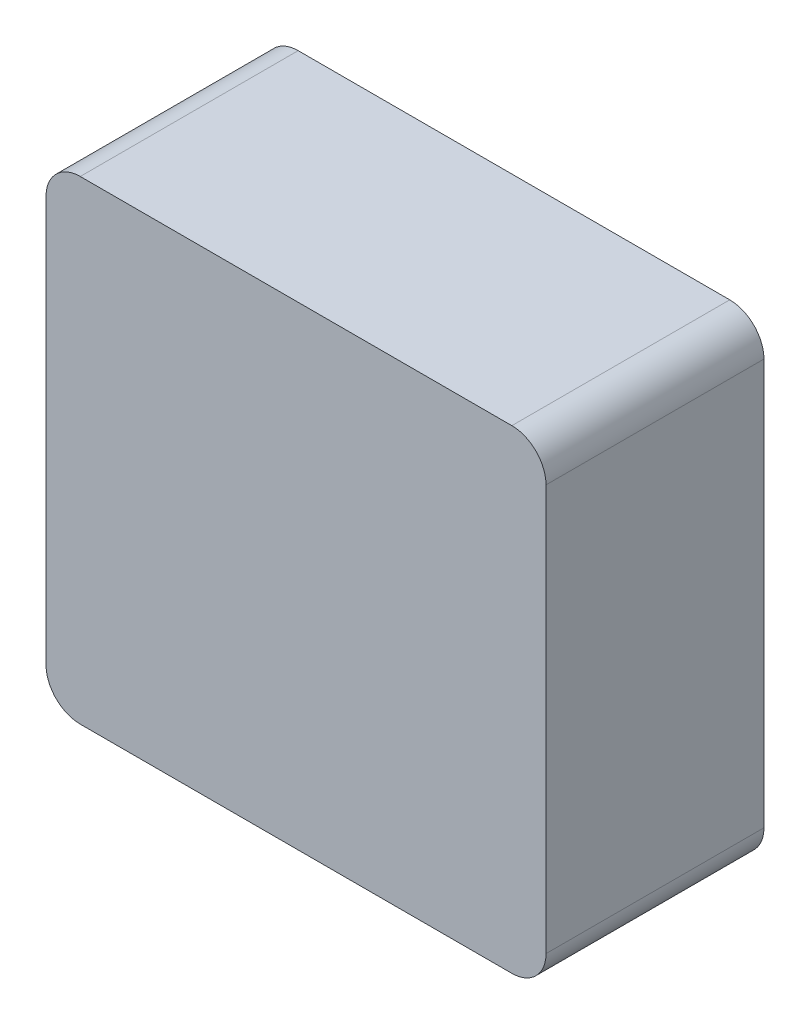
ISO-10303-21;
HEADER;
FILE_DESCRIPTION(('STEP AP214'),'2;1');
FILE_NAME('part.step','',(''),(''),'','','');
FILE_SCHEMA(('AUTOMOTIVE_DESIGN { 1 0 10303 214 1 1 1 1 }'));
ENDSEC;
DATA;
#1=APPLICATION_CONTEXT('core data for automotive mechanical design processes');
#2=APPLICATION_PROTOCOL_DEFINITION('international standard','automotive_design',2000,#1);
#3=PRODUCT_CONTEXT('',#1,'mechanical');
#4=PRODUCT('Part','Part','',(#3));
#5=PRODUCT_RELATED_PRODUCT_CATEGORY('part','',(#4));
#6=PRODUCT_DEFINITION_FORMATION('','',#4);
#7=PRODUCT_DEFINITION_CONTEXT('part definition',#1,'design');
#8=PRODUCT_DEFINITION('design','',#6,#7);
#9=PRODUCT_DEFINITION_SHAPE('','',#8);
#10=(LENGTH_UNIT() NAMED_UNIT(*) SI_UNIT(.MILLI.,.METRE.));
#11=(NAMED_UNIT(*) PLANE_ANGLE_UNIT() SI_UNIT($,.RADIAN.));
#12=(NAMED_UNIT(*) SI_UNIT($,.STERADIAN.) SOLID_ANGLE_UNIT());
#13=UNCERTAINTY_MEASURE_WITH_UNIT(LENGTH_MEASURE(1.E-05),#10,'distance_accuracy_value','');
#14=(GEOMETRIC_REPRESENTATION_CONTEXT(3) GLOBAL_UNCERTAINTY_ASSIGNED_CONTEXT((#13)) GLOBAL_UNIT_ASSIGNED_CONTEXT((#10,
#11,#12)) REPRESENTATION_CONTEXT('',''));
#15=CARTESIAN_POINT('',(0.,0.,0.));
#16=DIRECTION('',(0.,0.,1.));
#17=DIRECTION('',(1.,0.,0.));
#18=AXIS2_PLACEMENT_3D('',#15,#16,#17);
#19=CARTESIAN_POINT('',(11.25,100.5,-4.));
#20=DIRECTION('',(0.,0.,1.));
#21=DIRECTION('',(1.,0.,0.));
#22=AXIS2_PLACEMENT_3D('',#19,#20,#21);
#23=CYLINDRICAL_SURFACE('',#22,5.);
#24=CARTESIAN_POINT('',(11.25,100.5,-4.));
#25=DIRECTION('',(0.,0.,-1.));
#26=DIRECTION('',(-1.,0.,0.));
#27=AXIS2_PLACEMENT_3D('',#24,#25,#26);
#28=CIRCLE('',#27,5.);
#29=CARTESIAN_POINT('',(6.25000000000001,100.5,-4.));
#30=VERTEX_POINT('',#29);
#31=EDGE_CURVE('E51',#30,#30,#28,.T.);
#32=ORIENTED_EDGE('',*,*,#31,.F.);
#33=EDGE_LOOP('',(#32));
#34=FACE_BOUND('',#33,.T.);
#35=CARTESIAN_POINT('',(11.25,100.5,0.));
#36=DIRECTION('',(0.,0.,-1.));
#37=DIRECTION('',(-1.,0.,0.));
#38=AXIS2_PLACEMENT_3D('',#35,#36,#37);
#39=CIRCLE('',#38,5.);
#40=CARTESIAN_POINT('',(6.25000000000001,100.5,0.));
#41=VERTEX_POINT('',#40);
#42=EDGE_CURVE('E11',#41,#41,#39,.T.);
#43=ORIENTED_EDGE('',*,*,#42,.T.);
#44=EDGE_LOOP('',(#43));
#45=FACE_BOUND('',#44,.T.);
#46=ADVANCED_FACE('F47',(#34,#45),#23,.T.);
#47=CARTESIAN_POINT('',(11.25,100.5,-4.));
#48=DIRECTION('',(0.,0.,-1.));
#49=DIRECTION('',(-1.,0.,0.));
#50=AXIS2_PLACEMENT_3D('',#47,#48,#49);
#51=PLANE('',#50);
#52=CARTESIAN_POINT('',(11.25,100.5,-4.));
#53=DIRECTION('',(0.,0.,-1.));
#54=DIRECTION('',(-1.,0.,0.));
#55=AXIS2_PLACEMENT_3D('',#52,#53,#54);
#56=CIRCLE('',#55,3.5);
#57=CARTESIAN_POINT('',(7.75000000000001,100.5,-4.));
#58=VERTEX_POINT('',#57);
#59=EDGE_CURVE('E58',#58,#58,#56,.T.);
#60=ORIENTED_EDGE('',*,*,#59,.F.);
#61=EDGE_LOOP('',(#60));
#62=FACE_BOUND('',#61,.T.);
#63=ORIENTED_EDGE('',*,*,#31,.T.);
#64=EDGE_LOOP('',(#63));
#65=FACE_BOUND('',#64,.T.);
#66=ADVANCED_FACE('F49',(#62,#65),#51,.T.);
#67=CARTESIAN_POINT('',(11.25,100.5,0.));
#68=DIRECTION('',(0.,0.,-1.));
#69=DIRECTION('',(-1.,0.,0.));
#70=AXIS2_PLACEMENT_3D('',#67,#68,#69);
#71=PLANE('',#70);
#72=ORIENTED_EDGE('',*,*,#42,.F.);
#73=EDGE_LOOP('',(#72));
#74=FACE_BOUND('',#73,.T.);
#75=ADVANCED_FACE('F70',(#74),#71,.F.);
#76=CARTESIAN_POINT('',(11.25,100.5,-2.));
#77=DIRECTION('',(0.,0.,-1.));
#78=DIRECTION('',(-1.,0.,0.));
#79=AXIS2_PLACEMENT_3D('',#76,#77,#78);
#80=CYLINDRICAL_SURFACE('',#79,3.5);
#81=CARTESIAN_POINT('',(11.25,100.5,-2.));
#82=DIRECTION('',(0.,0.,-1.));
#83=DIRECTION('',(-1.,0.,0.));
#84=AXIS2_PLACEMENT_3D('',#81,#82,#83);
#85=CIRCLE('',#84,3.5);
#86=CARTESIAN_POINT('',(7.75000000000001,100.5,-2.));
#87=VERTEX_POINT('',#86);
#88=EDGE_CURVE('E60',#87,#87,#85,.T.);
#89=ORIENTED_EDGE('',*,*,#88,.F.);
#90=EDGE_LOOP('',(#89));
#91=FACE_BOUND('',#90,.T.);
#92=ORIENTED_EDGE('',*,*,#59,.T.);
#93=EDGE_LOOP('',(#92));
#94=FACE_BOUND('',#93,.T.);
#95=ADVANCED_FACE('F66',(#91,#94),#80,.F.);
#96=CARTESIAN_POINT('',(11.25,100.5,-2.));
#97=DIRECTION('',(0.,0.,-1.));
#98=DIRECTION('',(-1.,0.,0.));
#99=AXIS2_PLACEMENT_3D('',#96,#97,#98);
#100=PLANE('',#99);
#101=ORIENTED_EDGE('',*,*,#88,.T.);
#102=EDGE_LOOP('',(#101));
#103=FACE_BOUND('',#102,.T.);
#104=ADVANCED_FACE('F78',(#103),#100,.T.);
#105=CLOSED_SHELL('',(#46,#66,#75,#95,#104));
#106=MANIFOLD_SOLID_BREP('B2',#105);
#107=CARTESIAN_POINT('',(11.25,10.5,-4.));
#108=DIRECTION('',(0.,0.,1.));
#109=DIRECTION('',(1.,0.,0.));
#110=AXIS2_PLACEMENT_3D('',#107,#108,#109);
#111=CYLINDRICAL_SURFACE('',#110,5.);
#112=CARTESIAN_POINT('',(11.25,10.5,-4.));
#113=DIRECTION('',(0.,0.,-1.));
#114=DIRECTION('',(-1.,0.,0.));
#115=AXIS2_PLACEMENT_3D('',#112,#113,#114);
#116=CIRCLE('',#115,5.);
#117=CARTESIAN_POINT('',(6.25000000000001,10.5,-4.));
#118=VERTEX_POINT('',#117);
#119=EDGE_CURVE('E139',#118,#118,#116,.T.);
#120=ORIENTED_EDGE('',*,*,#119,.F.);
#121=EDGE_LOOP('',(#120));
#122=FACE_BOUND('',#121,.T.);
#123=CARTESIAN_POINT('',(11.25,10.5,0.));
#124=DIRECTION('',(0.,0.,-1.));
#125=DIRECTION('',(-1.,0.,0.));
#126=AXIS2_PLACEMENT_3D('',#123,#124,#125);
#127=CIRCLE('',#126,5.);
#128=CARTESIAN_POINT('',(6.25000000000001,10.5,0.));
#129=VERTEX_POINT('',#128);
#130=EDGE_CURVE('E46',#129,#129,#127,.T.);
#131=ORIENTED_EDGE('',*,*,#130,.T.);
#132=EDGE_LOOP('',(#131));
#133=FACE_BOUND('',#132,.T.);
#134=ADVANCED_FACE('F135',(#122,#133),#111,.T.);
#135=CARTESIAN_POINT('',(11.25,10.5,-4.));
#136=DIRECTION('',(0.,0.,-1.));
#137=DIRECTION('',(-1.,0.,0.));
#138=AXIS2_PLACEMENT_3D('',#135,#136,#137);
#139=PLANE('',#138);
#140=CARTESIAN_POINT('',(11.25,10.5,-4.));
#141=DIRECTION('',(0.,0.,-1.));
#142=DIRECTION('',(-1.,0.,0.));
#143=AXIS2_PLACEMENT_3D('',#140,#141,#142);
#144=CIRCLE('',#143,3.5);
#145=CARTESIAN_POINT('',(7.75000000000001,10.5,-4.));
#146=VERTEX_POINT('',#145);
#147=EDGE_CURVE('E146',#146,#146,#144,.T.);
#148=ORIENTED_EDGE('',*,*,#147,.F.);
#149=EDGE_LOOP('',(#148));
#150=FACE_BOUND('',#149,.T.);
#151=ORIENTED_EDGE('',*,*,#119,.T.);
#152=EDGE_LOOP('',(#151));
#153=FACE_BOUND('',#152,.T.);
#154=ADVANCED_FACE('F137',(#150,#153),#139,.T.);
#155=CARTESIAN_POINT('',(11.25,10.5,0.));
#156=DIRECTION('',(0.,0.,-1.));
#157=DIRECTION('',(-1.,0.,0.));
#158=AXIS2_PLACEMENT_3D('',#155,#156,#157);
#159=PLANE('',#158);
#160=ORIENTED_EDGE('',*,*,#130,.F.);
#161=EDGE_LOOP('',(#160));
#162=FACE_BOUND('',#161,.T.);
#163=ADVANCED_FACE('F158',(#162),#159,.F.);
#164=CARTESIAN_POINT('',(11.25,10.5,-2.));
#165=DIRECTION('',(0.,0.,-1.));
#166=DIRECTION('',(-1.,0.,0.));
#167=AXIS2_PLACEMENT_3D('',#164,#165,#166);
#168=CYLINDRICAL_SURFACE('',#167,3.5);
#169=CARTESIAN_POINT('',(11.25,10.5,-2.));
#170=DIRECTION('',(0.,0.,-1.));
#171=DIRECTION('',(-1.,0.,0.));
#172=AXIS2_PLACEMENT_3D('',#169,#170,#171);
#173=CIRCLE('',#172,3.5);
#174=CARTESIAN_POINT('',(7.75000000000001,10.5,-2.));
#175=VERTEX_POINT('',#174);
#176=EDGE_CURVE('E148',#175,#175,#173,.T.);
#177=ORIENTED_EDGE('',*,*,#176,.F.);
#178=EDGE_LOOP('',(#177));
#179=FACE_BOUND('',#178,.T.);
#180=ORIENTED_EDGE('',*,*,#147,.T.);
#181=EDGE_LOOP('',(#180));
#182=FACE_BOUND('',#181,.T.);
#183=ADVANCED_FACE('F154',(#179,#182),#168,.F.);
#184=CARTESIAN_POINT('',(11.25,10.5,-2.));
#185=DIRECTION('',(0.,0.,-1.));
#186=DIRECTION('',(-1.,0.,0.));
#187=AXIS2_PLACEMENT_3D('',#184,#185,#186);
#188=PLANE('',#187);
#189=ORIENTED_EDGE('',*,*,#176,.T.);
#190=EDGE_LOOP('',(#189));
#191=FACE_BOUND('',#190,.T.);
#192=ADVANCED_FACE('F166',(#191),#188,.T.);
#193=CLOSED_SHELL('',(#134,#154,#163,#183,#192));
#194=MANIFOLD_SOLID_BREP('B6',#193);
#195=CARTESIAN_POINT('',(105.75,10.5,-4.));
#196=DIRECTION('',(0.,0.,1.));
#197=DIRECTION('',(1.,0.,0.));
#198=AXIS2_PLACEMENT_3D('',#195,#196,#197);
#199=CYLINDRICAL_SURFACE('',#198,5.);
#200=CARTESIAN_POINT('',(105.75,10.5,-4.));
#201=DIRECTION('',(0.,0.,-1.));
#202=DIRECTION('',(-1.,0.,0.));
#203=AXIS2_PLACEMENT_3D('',#200,#201,#202);
#204=CIRCLE('',#203,5.);
#205=CARTESIAN_POINT('',(100.75,10.5,-4.));
#206=VERTEX_POINT('',#205);
#207=EDGE_CURVE('E227',#206,#206,#204,.T.);
#208=ORIENTED_EDGE('',*,*,#207,.F.);
#209=EDGE_LOOP('',(#208));
#210=FACE_BOUND('',#209,.T.);
#211=CARTESIAN_POINT('',(105.75,10.5,0.));
#212=DIRECTION('',(0.,0.,-1.));
#213=DIRECTION('',(-1.,0.,0.));
#214=AXIS2_PLACEMENT_3D('',#211,#212,#213);
#215=CIRCLE('',#214,5.);
#216=CARTESIAN_POINT('',(100.75,10.5,0.));
#217=VERTEX_POINT('',#216);
#218=EDGE_CURVE('E134',#217,#217,#215,.T.);
#219=ORIENTED_EDGE('',*,*,#218,.T.);
#220=EDGE_LOOP('',(#219));
#221=FACE_BOUND('',#220,.T.);
#222=ADVANCED_FACE('F223',(#210,#221),#199,.T.);
#223=CARTESIAN_POINT('',(105.75,10.5,-4.));
#224=DIRECTION('',(0.,0.,-1.));
#225=DIRECTION('',(-1.,0.,0.));
#226=AXIS2_PLACEMENT_3D('',#223,#224,#225);
#227=PLANE('',#226);
#228=CARTESIAN_POINT('',(105.75,10.5,-4.));
#229=DIRECTION('',(0.,0.,-1.));
#230=DIRECTION('',(-1.,0.,0.));
#231=AXIS2_PLACEMENT_3D('',#228,#229,#230);
#232=CIRCLE('',#231,3.50000000000001);
#233=CARTESIAN_POINT('',(102.25,10.5,-4.));
#234=VERTEX_POINT('',#233);
#235=EDGE_CURVE('E234',#234,#234,#232,.T.);
#236=ORIENTED_EDGE('',*,*,#235,.F.);
#237=EDGE_LOOP('',(#236));
#238=FACE_BOUND('',#237,.T.);
#239=ORIENTED_EDGE('',*,*,#207,.T.);
#240=EDGE_LOOP('',(#239));
#241=FACE_BOUND('',#240,.T.);
#242=ADVANCED_FACE('F225',(#238,#241),#227,.T.);
#243=CARTESIAN_POINT('',(105.75,10.5,0.));
#244=DIRECTION('',(0.,0.,-1.));
#245=DIRECTION('',(-1.,0.,0.));
#246=AXIS2_PLACEMENT_3D('',#243,#244,#245);
#247=PLANE('',#246);
#248=ORIENTED_EDGE('',*,*,#218,.F.);
#249=EDGE_LOOP('',(#248));
#250=FACE_BOUND('',#249,.T.);
#251=ADVANCED_FACE('F246',(#250),#247,.F.);
#252=CARTESIAN_POINT('',(105.75,10.5,-2.));
#253=DIRECTION('',(0.,0.,-1.));
#254=DIRECTION('',(-1.,0.,0.));
#255=AXIS2_PLACEMENT_3D('',#252,#253,#254);
#256=CYLINDRICAL_SURFACE('',#255,3.50000000000001);
#257=CARTESIAN_POINT('',(105.75,10.5,-2.));
#258=DIRECTION('',(0.,0.,-1.));
#259=DIRECTION('',(-1.,0.,0.));
#260=AXIS2_PLACEMENT_3D('',#257,#258,#259);
#261=CIRCLE('',#260,3.50000000000001);
#262=CARTESIAN_POINT('',(102.25,10.5,-2.));
#263=VERTEX_POINT('',#262);
#264=EDGE_CURVE('E236',#263,#263,#261,.T.);
#265=ORIENTED_EDGE('',*,*,#264,.F.);
#266=EDGE_LOOP('',(#265));
#267=FACE_BOUND('',#266,.T.);
#268=ORIENTED_EDGE('',*,*,#235,.T.);
#269=EDGE_LOOP('',(#268));
#270=FACE_BOUND('',#269,.T.);
#271=ADVANCED_FACE('F242',(#267,#270),#256,.F.);
#272=CARTESIAN_POINT('',(105.75,10.5,-2.));
#273=DIRECTION('',(0.,0.,-1.));
#274=DIRECTION('',(-1.,0.,0.));
#275=AXIS2_PLACEMENT_3D('',#272,#273,#274);
#276=PLANE('',#275);
#277=ORIENTED_EDGE('',*,*,#264,.T.);
#278=EDGE_LOOP('',(#277));
#279=FACE_BOUND('',#278,.T.);
#280=ADVANCED_FACE('F254',(#279),#276,.T.);
#281=CLOSED_SHELL('',(#222,#242,#251,#271,#280));
#282=MANIFOLD_SOLID_BREP('B41',#281);
#283=CARTESIAN_POINT('',(105.75,100.5,-4.));
#284=DIRECTION('',(0.,0.,1.));
#285=DIRECTION('',(1.,0.,0.));
#286=AXIS2_PLACEMENT_3D('',#283,#284,#285);
#287=CYLINDRICAL_SURFACE('',#286,5.00000000000001);
#288=CARTESIAN_POINT('',(105.75,100.5,-4.));
#289=DIRECTION('',(0.,0.,-1.));
#290=DIRECTION('',(-1.,0.,0.));
#291=AXIS2_PLACEMENT_3D('',#288,#289,#290);
#292=CIRCLE('',#291,5.00000000000001);
#293=CARTESIAN_POINT('',(100.75,100.5,-4.));
#294=VERTEX_POINT('',#293);
#295=EDGE_CURVE('E222',#294,#294,#292,.T.);
#296=ORIENTED_EDGE('',*,*,#295,.F.);
#297=EDGE_LOOP('',(#296));
#298=FACE_BOUND('',#297,.T.);
#299=CARTESIAN_POINT('',(105.75,100.5,0.));
#300=DIRECTION('',(0.,0.,-1.));
#301=DIRECTION('',(-1.,0.,0.));
#302=AXIS2_PLACEMENT_3D('',#299,#300,#301);
#303=CIRCLE('',#302,5.00000000000001);
#304=CARTESIAN_POINT('',(100.75,100.5,0.));
#305=VERTEX_POINT('',#304);
#306=EDGE_CURVE('E315',#305,#305,#303,.T.);
#307=ORIENTED_EDGE('',*,*,#306,.T.);
#308=EDGE_LOOP('',(#307));
#309=FACE_BOUND('',#308,.T.);
#310=ADVANCED_FACE('F312',(#298,#309),#287,.T.);
#311=CARTESIAN_POINT('',(105.75,100.5,-4.));
#312=DIRECTION('',(0.,0.,-1.));
#313=DIRECTION('',(-1.,0.,0.));
#314=AXIS2_PLACEMENT_3D('',#311,#312,#313);
#315=PLANE('',#314);
#316=CARTESIAN_POINT('',(105.75,100.5,-4.));
#317=DIRECTION('',(0.,0.,-1.));
#318=DIRECTION('',(-1.,0.,0.));
#319=AXIS2_PLACEMENT_3D('',#316,#317,#318);
#320=CIRCLE('',#319,3.50000000000001);
#321=CARTESIAN_POINT('',(102.25,100.5,-4.));
#322=VERTEX_POINT('',#321);
#323=EDGE_CURVE('E324',#322,#322,#320,.T.);
#324=ORIENTED_EDGE('',*,*,#323,.F.);
#325=EDGE_LOOP('',(#324));
#326=FACE_BOUND('',#325,.T.);
#327=ORIENTED_EDGE('',*,*,#295,.T.);
#328=EDGE_LOOP('',(#327));
#329=FACE_BOUND('',#328,.T.);
#330=ADVANCED_FACE('F339',(#326,#329),#315,.T.);
#331=CARTESIAN_POINT('',(105.75,100.5,0.));
#332=DIRECTION('',(0.,0.,-1.));
#333=DIRECTION('',(-1.,0.,0.));
#334=AXIS2_PLACEMENT_3D('',#331,#332,#333);
#335=PLANE('',#334);
#336=ORIENTED_EDGE('',*,*,#306,.F.);
#337=EDGE_LOOP('',(#336));
#338=FACE_BOUND('',#337,.T.);
#339=ADVANCED_FACE('F335',(#338),#335,.F.);
#340=CARTESIAN_POINT('',(105.75,100.5,-2.));
#341=DIRECTION('',(0.,0.,-1.));
#342=DIRECTION('',(-1.,0.,0.));
#343=AXIS2_PLACEMENT_3D('',#340,#341,#342);
#344=CYLINDRICAL_SURFACE('',#343,3.50000000000001);
#345=CARTESIAN_POINT('',(105.75,100.5,-2.));
#346=DIRECTION('',(0.,0.,-1.));
#347=DIRECTION('',(-1.,0.,0.));
#348=AXIS2_PLACEMENT_3D('',#345,#346,#347);
#349=CIRCLE('',#348,3.50000000000001);
#350=CARTESIAN_POINT('',(102.25,100.5,-2.));
#351=VERTEX_POINT('',#350);
#352=EDGE_CURVE('E322',#351,#351,#349,.T.);
#353=ORIENTED_EDGE('',*,*,#352,.F.);
#354=EDGE_LOOP('',(#353));
#355=FACE_BOUND('',#354,.T.);
#356=ORIENTED_EDGE('',*,*,#323,.T.);
#357=EDGE_LOOP('',(#356));
#358=FACE_BOUND('',#357,.T.);
#359=ADVANCED_FACE('F332',(#355,#358),#344,.F.);
#360=CARTESIAN_POINT('',(105.75,100.5,-2.));
#361=DIRECTION('',(0.,0.,-1.));
#362=DIRECTION('',(-1.,0.,0.));
#363=AXIS2_PLACEMENT_3D('',#360,#361,#362);
#364=PLANE('',#363);
#365=ORIENTED_EDGE('',*,*,#352,.T.);
#366=EDGE_LOOP('',(#365));
#367=FACE_BOUND('',#366,.T.);
#368=ADVANCED_FACE('F330',(#367),#364,.T.);
#369=CLOSED_SHELL('',(#310,#330,#339,#359,#368));
#370=MANIFOLD_SOLID_BREP('B129',#369);
#371=CARTESIAN_POINT('',(0.,0.,51.));
#372=DIRECTION('',(0.,1.,0.));
#373=DIRECTION('',(0.,0.,1.));
#374=AXIS2_PLACEMENT_3D('',#371,#372,#373);
#375=PLANE('',#374);
#376=DIRECTION('',(0.,0.,-1.));
#377=VECTOR('',#376,1.);
#378=CARTESIAN_POINT('',(8.,0.,51.));
#379=LINE('',#378,#377);
#380=CARTESIAN_POINT('',(8.,0.,51.));
#381=VERTEX_POINT('',#380);
#382=CARTESIAN_POINT('',(8.,0.,36.5));
#383=VERTEX_POINT('',#382);
#384=EDGE_CURVE('E513',#381,#383,#379,.T.);
#385=ORIENTED_EDGE('',*,*,#384,.T.);
#386=DIRECTION('',(-1.,0.,0.));
#387=VECTOR('',#386,1.);
#388=CARTESIAN_POINT('',(8.,0.,36.5));
#389=LINE('',#388,#387);
#390=CARTESIAN_POINT('',(109.,0.,36.5));
#391=VERTEX_POINT('',#390);
#392=EDGE_CURVE('E525',#391,#383,#389,.T.);
#393=ORIENTED_EDGE('',*,*,#392,.F.);
#394=DIRECTION('',(0.,0.,-1.));
#395=VECTOR('',#394,1.);
#396=CARTESIAN_POINT('',(109.,0.,51.));
#397=LINE('',#396,#395);
#398=CARTESIAN_POINT('',(109.,0.,51.));
#399=VERTEX_POINT('',#398);
#400=EDGE_CURVE('E575',#391,#399,#397,.F.);
#401=ORIENTED_EDGE('',*,*,#400,.T.);
#402=DIRECTION('',(1.,0.,0.));
#403=VECTOR('',#402,1.);
#404=CARTESIAN_POINT('',(0.,0.,51.));
#405=LINE('',#404,#403);
#406=EDGE_CURVE('E530',#381,#399,#405,.T.);
#407=ORIENTED_EDGE('',*,*,#406,.F.);
#408=EDGE_LOOP('',(#385,#393,#401,#407));
#409=FACE_BOUND('',#408,.T.);
#410=ADVANCED_FACE('F392',(#409),#375,.F.);
#411=CARTESIAN_POINT('',(0.,0.,51.));
#412=DIRECTION('',(1.,0.,0.));
#413=DIRECTION('',(0.,0.,-1.));
#414=AXIS2_PLACEMENT_3D('',#411,#412,#413);
#415=PLANE('',#414);
#416=DIRECTION('',(0.,-1.,0.));
#417=VECTOR('',#416,1.);
#418=CARTESIAN_POINT('',(0.,0.,51.));
#419=LINE('',#418,#417);
#420=CARTESIAN_POINT('',(0.,103.,51.));
#421=VERTEX_POINT('',#420);
#422=CARTESIAN_POINT('',(0.,8.,51.));
#423=VERTEX_POINT('',#422);
#424=EDGE_CURVE('E527',#421,#423,#419,.T.);
#425=ORIENTED_EDGE('',*,*,#424,.F.);
#426=DIRECTION('',(0.,0.,-1.));
#427=VECTOR('',#426,1.);
#428=CARTESIAN_POINT('',(0.,103.,51.));
#429=LINE('',#428,#427);
#430=CARTESIAN_POINT('',(0.,103.,0.));
#431=VERTEX_POINT('',#430);
#432=EDGE_CURVE('E552',#421,#431,#429,.T.);
#433=ORIENTED_EDGE('',*,*,#432,.T.);
#434=DIRECTION('',(0.,-1.,0.));
#435=VECTOR('',#434,1.);
#436=CARTESIAN_POINT('',(0.,0.,0.));
#437=LINE('',#436,#435);
#438=CARTESIAN_POINT('',(0.,8.,0.));
#439=VERTEX_POINT('',#438);
#440=EDGE_CURVE('E541',#431,#439,#437,.T.);
#441=ORIENTED_EDGE('',*,*,#440,.T.);
#442=DIRECTION('',(0.,0.,-1.));
#443=VECTOR('',#442,1.);
#444=CARTESIAN_POINT('',(0.,8.,51.));
#445=LINE('',#444,#443);
#446=EDGE_CURVE('E540',#439,#423,#445,.F.);
#447=ORIENTED_EDGE('',*,*,#446,.T.);
#448=EDGE_LOOP('',(#425,#433,#441,#447));
#449=FACE_BOUND('',#448,.T.);
#450=ADVANCED_FACE('F623',(#449),#415,.F.);
#451=CARTESIAN_POINT('',(109.,0.,0.));
#452=VERTEX_POINT('',#451);
#453=CARTESIAN_POINT('',(109.,0.,19.5));
#454=VERTEX_POINT('',#453);
#455=EDGE_CURVE('E499',#452,#454,#397,.F.);
#456=ORIENTED_EDGE('',*,*,#455,.T.);
#457=DIRECTION('',(1.,0.,0.));
#458=VECTOR('',#457,1.);
#459=CARTESIAN_POINT('',(8.,0.,19.5));
#460=LINE('',#459,#458);
#461=CARTESIAN_POINT('',(8.,0.,19.5));
#462=VERTEX_POINT('',#461);
#463=EDGE_CURVE('E483',#462,#454,#460,.T.);
#464=ORIENTED_EDGE('',*,*,#463,.F.);
#465=CARTESIAN_POINT('',(8.,0.,0.));
#466=VERTEX_POINT('',#465);
#467=EDGE_CURVE('E496',#462,#466,#379,.T.);
#468=ORIENTED_EDGE('',*,*,#467,.T.);
#469=DIRECTION('',(1.,0.,0.));
#470=VECTOR('',#469,1.);
#471=CARTESIAN_POINT('',(0.,0.,0.));
#472=LINE('',#471,#470);
#473=EDGE_CURVE('E544',#466,#452,#472,.T.);
#474=ORIENTED_EDGE('',*,*,#473,.T.);
#475=EDGE_LOOP('',(#456,#464,#468,#474));
#476=FACE_BOUND('',#475,.T.);
#477=ADVANCED_FACE('F494',(#476),#375,.F.);
#478=CARTESIAN_POINT('',(117.,0.,51.));
#479=DIRECTION('',(-1.,0.,0.));
#480=DIRECTION('',(0.,0.,1.));
#481=AXIS2_PLACEMENT_3D('',#478,#479,#480);
#482=PLANE('',#481);
#483=DIRECTION('',(0.,1.,0.));
#484=VECTOR('',#483,1.);
#485=CARTESIAN_POINT('',(117.,0.,51.));
#486=LINE('',#485,#484);
#487=CARTESIAN_POINT('',(117.,8.,51.));
#488=VERTEX_POINT('',#487);
#489=CARTESIAN_POINT('',(117.,103.,51.));
#490=VERTEX_POINT('',#489);
#491=EDGE_CURVE('E534',#488,#490,#486,.T.);
#492=ORIENTED_EDGE('',*,*,#491,.F.);
#493=DIRECTION('',(0.,0.,-1.));
#494=VECTOR('',#493,1.);
#495=CARTESIAN_POINT('',(117.,8.,51.));
#496=LINE('',#495,#494);
#497=CARTESIAN_POINT('',(117.,8.,0.));
#498=VERTEX_POINT('',#497);
#499=EDGE_CURVE('E579',#488,#498,#496,.T.);
#500=ORIENTED_EDGE('',*,*,#499,.T.);
#501=DIRECTION('',(0.,1.,0.));
#502=VECTOR('',#501,1.);
#503=CARTESIAN_POINT('',(117.,0.,0.));
#504=LINE('',#503,#502);
#505=CARTESIAN_POINT('',(117.,103.,0.));
#506=VERTEX_POINT('',#505);
#507=EDGE_CURVE('E546',#498,#506,#504,.T.);
#508=ORIENTED_EDGE('',*,*,#507,.T.);
#509=DIRECTION('',(0.,0.,-1.));
#510=VECTOR('',#509,1.);
#511=CARTESIAN_POINT('',(117.,103.,51.));
#512=LINE('',#511,#510);
#513=EDGE_CURVE('E577',#506,#490,#512,.F.);
#514=ORIENTED_EDGE('',*,*,#513,.T.);
#515=EDGE_LOOP('',(#492,#500,#508,#514));
#516=FACE_BOUND('',#515,.T.);
#517=ADVANCED_FACE('F640',(#516),#482,.F.);
#518=CARTESIAN_POINT('',(0.,111.,51.));
#519=DIRECTION('',(0.,-1.,0.));
#520=DIRECTION('',(0.,0.,-1.));
#521=AXIS2_PLACEMENT_3D('',#518,#519,#520);
#522=PLANE('',#521);
#523=DIRECTION('',(-1.,0.,0.));
#524=VECTOR('',#523,1.);
#525=CARTESIAN_POINT('',(0.,111.,0.));
#526=LINE('',#525,#524);
#527=CARTESIAN_POINT('',(109.,111.,0.));
#528=VERTEX_POINT('',#527);
#529=CARTESIAN_POINT('',(8.,111.,0.));
#530=VERTEX_POINT('',#529);
#531=EDGE_CURVE('E531',#528,#530,#526,.T.);
#532=ORIENTED_EDGE('',*,*,#531,.T.);
#533=DIRECTION('',(0.,0.,-1.));
#534=VECTOR('',#533,1.);
#535=CARTESIAN_POINT('',(8.,111.,51.));
#536=LINE('',#535,#534);
#537=CARTESIAN_POINT('',(8.,111.,51.));
#538=VERTEX_POINT('',#537);
#539=EDGE_CURVE('E565',#530,#538,#536,.F.);
#540=ORIENTED_EDGE('',*,*,#539,.T.);
#541=DIRECTION('',(-1.,0.,0.));
#542=VECTOR('',#541,1.);
#543=CARTESIAN_POINT('',(0.,111.,51.));
#544=LINE('',#543,#542);
#545=CARTESIAN_POINT('',(109.,111.,51.));
#546=VERTEX_POINT('',#545);
#547=EDGE_CURVE('E537',#546,#538,#544,.T.);
#548=ORIENTED_EDGE('',*,*,#547,.F.);
#549=DIRECTION('',(0.,0.,-1.));
#550=VECTOR('',#549,1.);
#551=CARTESIAN_POINT('',(109.,111.,51.));
#552=LINE('',#551,#550);
#553=EDGE_CURVE('E562',#546,#528,#552,.T.);
#554=ORIENTED_EDGE('',*,*,#553,.T.);
#555=EDGE_LOOP('',(#532,#540,#548,#554));
#556=FACE_BOUND('',#555,.T.);
#557=ADVANCED_FACE('F631',(#556),#522,.F.);
#558=CARTESIAN_POINT('',(0.,0.,51.));
#559=DIRECTION('',(0.,0.,-1.));
#560=DIRECTION('',(-1.,0.,0.));
#561=AXIS2_PLACEMENT_3D('',#558,#559,#560);
#562=PLANE('',#561);
#563=ORIENTED_EDGE('',*,*,#547,.T.);
#564=CARTESIAN_POINT('',(8.,103.,51.));
#565=DIRECTION('',(0.,0.,-1.));
#566=DIRECTION('',(-1.,0.,0.));
#567=AXIS2_PLACEMENT_3D('',#564,#565,#566);
#568=CIRCLE('',#567,8.);
#569=EDGE_CURVE('E573',#538,#421,#568,.F.);
#570=ORIENTED_EDGE('',*,*,#569,.T.);
#571=ORIENTED_EDGE('',*,*,#424,.T.);
#572=CARTESIAN_POINT('',(8.,8.,51.));
#573=DIRECTION('',(0.,0.,-1.));
#574=DIRECTION('',(-1.,0.,0.));
#575=AXIS2_PLACEMENT_3D('',#572,#573,#574);
#576=CIRCLE('',#575,8.);
#577=EDGE_CURVE('E571',#423,#381,#576,.F.);
#578=ORIENTED_EDGE('',*,*,#577,.T.);
#579=ORIENTED_EDGE('',*,*,#406,.T.);
#580=CARTESIAN_POINT('',(109.,8.,51.));
#581=DIRECTION('',(0.,0.,-1.));
#582=DIRECTION('',(-1.,0.,0.));
#583=AXIS2_PLACEMENT_3D('',#580,#581,#582);
#584=CIRCLE('',#583,8.);
#585=EDGE_CURVE('E569',#399,#488,#584,.F.);
#586=ORIENTED_EDGE('',*,*,#585,.T.);
#587=ORIENTED_EDGE('',*,*,#491,.T.);
#588=CARTESIAN_POINT('',(109.,103.,51.));
#589=DIRECTION('',(0.,0.,-1.));
#590=DIRECTION('',(-1.,0.,0.));
#591=AXIS2_PLACEMENT_3D('',#588,#589,#590);
#592=CIRCLE('',#591,8.);
#593=EDGE_CURVE('E567',#490,#546,#592,.F.);
#594=ORIENTED_EDGE('',*,*,#593,.T.);
#595=EDGE_LOOP('',(#563,#570,#571,#578,#579,#586,#587,#594));
#596=FACE_BOUND('',#595,.T.);
#597=ADVANCED_FACE('F615',(#596),#562,.F.);
#598=CARTESIAN_POINT('',(0.,0.,0.));
#599=DIRECTION('',(0.,0.,-1.));
#600=DIRECTION('',(-1.,0.,0.));
#601=AXIS2_PLACEMENT_3D('',#598,#599,#600);
#602=PLANE('',#601);
#603=CARTESIAN_POINT('',(58.5,97.5,0.));
#604=DIRECTION('',(0.,0.,-1.));
#605=DIRECTION('',(-1.,0.,0.));
#606=AXIS2_PLACEMENT_3D('',#603,#604,#605);
#607=CIRCLE('',#606,1.5);
#608=CARTESIAN_POINT('',(57.,97.5,0.));
#609=VERTEX_POINT('',#608);
#610=EDGE_CURVE('E518',#609,#609,#607,.T.);
#611=ORIENTED_EDGE('',*,*,#610,.F.);
#612=EDGE_LOOP('',(#611));
#613=FACE_BOUND('',#612,.T.);
#614=CARTESIAN_POINT('',(58.5,13.5,0.));
#615=DIRECTION('',(0.,0.,-1.));
#616=DIRECTION('',(-1.,0.,0.));
#617=AXIS2_PLACEMENT_3D('',#614,#615,#616);
#618=CIRCLE('',#617,1.5);
#619=CARTESIAN_POINT('',(57.,13.5,0.));
#620=VERTEX_POINT('',#619);
#621=EDGE_CURVE('E603',#620,#620,#618,.T.);
#622=ORIENTED_EDGE('',*,*,#621,.F.);
#623=EDGE_LOOP('',(#622));
#624=FACE_BOUND('',#623,.T.);
#625=ORIENTED_EDGE('',*,*,#440,.F.);
#626=CARTESIAN_POINT('',(8.,103.,0.));
#627=DIRECTION('',(0.,0.,-1.));
#628=DIRECTION('',(-1.,0.,0.));
#629=AXIS2_PLACEMENT_3D('',#626,#627,#628);
#630=CIRCLE('',#629,8.);
#631=EDGE_CURVE('E560',#431,#530,#630,.T.);
#632=ORIENTED_EDGE('',*,*,#631,.T.);
#633=ORIENTED_EDGE('',*,*,#531,.F.);
#634=CARTESIAN_POINT('',(109.,103.,0.));
#635=DIRECTION('',(0.,0.,-1.));
#636=DIRECTION('',(-1.,0.,0.));
#637=AXIS2_PLACEMENT_3D('',#634,#635,#636);
#638=CIRCLE('',#637,8.);
#639=EDGE_CURVE('E555',#528,#506,#638,.T.);
#640=ORIENTED_EDGE('',*,*,#639,.T.);
#641=ORIENTED_EDGE('',*,*,#507,.F.);
#642=CARTESIAN_POINT('',(109.,8.,0.));
#643=DIRECTION('',(0.,0.,-1.));
#644=DIRECTION('',(-1.,0.,0.));
#645=AXIS2_PLACEMENT_3D('',#642,#643,#644);
#646=CIRCLE('',#645,8.);
#647=EDGE_CURVE('E557',#498,#452,#646,.T.);
#648=ORIENTED_EDGE('',*,*,#647,.T.);
#649=ORIENTED_EDGE('',*,*,#473,.F.);
#650=CARTESIAN_POINT('',(8.,8.,0.));
#651=DIRECTION('',(0.,0.,-1.));
#652=DIRECTION('',(-1.,0.,0.));
#653=AXIS2_PLACEMENT_3D('',#650,#651,#652);
#654=CIRCLE('',#653,8.);
#655=EDGE_CURVE('E511',#466,#439,#654,.T.);
#656=ORIENTED_EDGE('',*,*,#655,.T.);
#657=EDGE_LOOP('',(#625,#632,#633,#640,#641,#648,#649,#656));
#658=FACE_BOUND('',#657,.T.);
#659=ADVANCED_FACE('F611',(#613,#624,#658),#602,.T.);
#660=CARTESIAN_POINT('',(8.,103.,51.));
#661=DIRECTION('',(0.,0.,-1.));
#662=DIRECTION('',(-1.,0.,0.));
#663=AXIS2_PLACEMENT_3D('',#660,#661,#662);
#664=CYLINDRICAL_SURFACE('',#663,8.);
#665=ORIENTED_EDGE('',*,*,#569,.F.);
#666=ORIENTED_EDGE('',*,*,#539,.F.);
#667=ORIENTED_EDGE('',*,*,#631,.F.);
#668=ORIENTED_EDGE('',*,*,#432,.F.);
#669=EDGE_LOOP('',(#665,#666,#667,#668));
#670=FACE_BOUND('',#669,.T.);
#671=ADVANCED_FACE('F614',(#670),#664,.T.);
#672=CARTESIAN_POINT('',(8.,8.,51.));
#673=DIRECTION('',(0.,0.,-1.));
#674=DIRECTION('',(-1.,0.,0.));
#675=AXIS2_PLACEMENT_3D('',#672,#673,#674);
#676=CYLINDRICAL_SURFACE('',#675,8.);
#677=ORIENTED_EDGE('',*,*,#577,.F.);
#678=ORIENTED_EDGE('',*,*,#446,.F.);
#679=ORIENTED_EDGE('',*,*,#655,.F.);
#680=ORIENTED_EDGE('',*,*,#467,.F.);
#681=DIRECTION('',(0.,0.,-1.));
#682=VECTOR('',#681,1.);
#683=CARTESIAN_POINT('',(8.,0.,36.5));
#684=LINE('',#683,#682);
#685=EDGE_CURVE('E502',#383,#462,#684,.T.);
#686=ORIENTED_EDGE('',*,*,#685,.F.);
#687=ORIENTED_EDGE('',*,*,#384,.F.);
#688=EDGE_LOOP('',(#677,#678,#679,#680,#686,#687));
#689=FACE_BOUND('',#688,.T.);
#690=ADVANCED_FACE('F507',(#689),#676,.T.);
#691=CARTESIAN_POINT('',(109.,8.,51.));
#692=DIRECTION('',(0.,0.,-1.));
#693=DIRECTION('',(-1.,0.,0.));
#694=AXIS2_PLACEMENT_3D('',#691,#692,#693);
#695=CYLINDRICAL_SURFACE('',#694,8.);
#696=ORIENTED_EDGE('',*,*,#585,.F.);
#697=ORIENTED_EDGE('',*,*,#400,.F.);
#698=DIRECTION('',(0.,0.,1.));
#699=VECTOR('',#698,1.);
#700=CARTESIAN_POINT('',(109.,0.,36.5));
#701=LINE('',#700,#699);
#702=EDGE_CURVE('E501',#454,#391,#701,.T.);
#703=ORIENTED_EDGE('',*,*,#702,.F.);
#704=ORIENTED_EDGE('',*,*,#455,.F.);
#705=ORIENTED_EDGE('',*,*,#647,.F.);
#706=ORIENTED_EDGE('',*,*,#499,.F.);
#707=EDGE_LOOP('',(#696,#697,#703,#704,#705,#706));
#708=FACE_BOUND('',#707,.T.);
#709=ADVANCED_FACE('F594',(#708),#695,.T.);
#710=CARTESIAN_POINT('',(109.,103.,51.));
#711=DIRECTION('',(0.,0.,-1.));
#712=DIRECTION('',(-1.,0.,0.));
#713=AXIS2_PLACEMENT_3D('',#710,#711,#712);
#714=CYLINDRICAL_SURFACE('',#713,8.);
#715=ORIENTED_EDGE('',*,*,#593,.F.);
#716=ORIENTED_EDGE('',*,*,#513,.F.);
#717=ORIENTED_EDGE('',*,*,#639,.F.);
#718=ORIENTED_EDGE('',*,*,#553,.F.);
#719=EDGE_LOOP('',(#715,#716,#717,#718));
#720=FACE_BOUND('',#719,.T.);
#721=ADVANCED_FACE('F637',(#720),#714,.T.);
#722=CARTESIAN_POINT('',(8.,0.5,36.5));
#723=DIRECTION('',(0.,0.,1.));
#724=DIRECTION('',(1.,0.,0.));
#725=AXIS2_PLACEMENT_3D('',#722,#723,#724);
#726=PLANE('',#725);
#727=DIRECTION('',(-1.,0.,0.));
#728=VECTOR('',#727,1.);
#729=CARTESIAN_POINT('',(8.,0.5,36.5));
#730=LINE('',#729,#728);
#731=CARTESIAN_POINT('',(102.31045591987,0.5,36.5));
#732=VERTEX_POINT('',#731);
#733=CARTESIAN_POINT('',(14.6895440801298,0.5,36.5));
#734=VERTEX_POINT('',#733);
#735=EDGE_CURVE('E521',#732,#734,#730,.T.);
#736=ORIENTED_EDGE('',*,*,#735,.F.);
#737=CARTESIAN_POINT('',(102.31045591987,-44.5,36.5));
#738=DIRECTION('',(0.,0.,1.));
#739=DIRECTION('',(1.,0.,0.));
#740=AXIS2_PLACEMENT_3D('',#737,#738,#739);
#741=CIRCLE('',#740,45.);
#742=EDGE_CURVE('E415',#732,#391,#741,.F.);
#743=ORIENTED_EDGE('',*,*,#742,.T.);
#744=ORIENTED_EDGE('',*,*,#392,.T.);
#745=CARTESIAN_POINT('',(14.6895440801298,-44.5,36.5));
#746=DIRECTION('',(0.,0.,1.));
#747=DIRECTION('',(1.,0.,0.));
#748=AXIS2_PLACEMENT_3D('',#745,#746,#747);
#749=CIRCLE('',#748,45.);
#750=EDGE_CURVE('E407',#383,#734,#749,.F.);
#751=ORIENTED_EDGE('',*,*,#750,.T.);
#752=EDGE_LOOP('',(#736,#743,#744,#751));
#753=FACE_BOUND('',#752,.T.);
#754=ADVANCED_FACE('F588',(#753),#726,.F.);
#755=CARTESIAN_POINT('',(8.,0.5,19.5));
#756=DIRECTION('',(0.,0.,-1.));
#757=DIRECTION('',(-1.,0.,0.));
#758=AXIS2_PLACEMENT_3D('',#755,#756,#757);
#759=PLANE('',#758);
#760=ORIENTED_EDGE('',*,*,#463,.T.);
#761=CARTESIAN_POINT('',(102.31045591987,-44.5,19.5));
#762=DIRECTION('',(0.,0.,-1.));
#763=DIRECTION('',(-1.,0.,0.));
#764=AXIS2_PLACEMENT_3D('',#761,#762,#763);
#765=CIRCLE('',#764,45.);
#766=CARTESIAN_POINT('',(102.31045591987,0.5,19.5));
#767=VERTEX_POINT('',#766);
#768=EDGE_CURVE('E310',#454,#767,#765,.F.);
#769=ORIENTED_EDGE('',*,*,#768,.T.);
#770=DIRECTION('',(1.,0.,0.));
#771=VECTOR('',#770,1.);
#772=CARTESIAN_POINT('',(8.,0.5,19.5));
#773=LINE('',#772,#771);
#774=CARTESIAN_POINT('',(14.6895440801298,0.5,19.5));
#775=VERTEX_POINT('',#774);
#776=EDGE_CURVE('E486',#775,#767,#773,.T.);
#777=ORIENTED_EDGE('',*,*,#776,.F.);
#778=CARTESIAN_POINT('',(14.6895440801298,-44.5,19.5));
#779=DIRECTION('',(0.,0.,-1.));
#780=DIRECTION('',(-1.,0.,0.));
#781=AXIS2_PLACEMENT_3D('',#778,#779,#780);
#782=CIRCLE('',#781,45.);
#783=EDGE_CURVE('E400',#775,#462,#782,.F.);
#784=ORIENTED_EDGE('',*,*,#783,.T.);
#785=EDGE_LOOP('',(#760,#769,#777,#784));
#786=FACE_BOUND('',#785,.T.);
#787=ADVANCED_FACE('F482',(#786),#759,.F.);
#788=CARTESIAN_POINT('',(0.,0.5,0.));
#789=DIRECTION('',(0.,-1.,0.));
#790=DIRECTION('',(0.,0.,-1.));
#791=AXIS2_PLACEMENT_3D('',#788,#789,#790);
#792=PLANE('',#791);
#793=ORIENTED_EDGE('',*,*,#776,.T.);
#794=DIRECTION('',(0.,0.,1.));
#795=VECTOR('',#794,1.);
#796=CARTESIAN_POINT('',(102.31045591987,0.5,36.5));
#797=LINE('',#796,#795);
#798=EDGE_CURVE('E584',#767,#732,#797,.T.);
#799=ORIENTED_EDGE('',*,*,#798,.T.);
#800=ORIENTED_EDGE('',*,*,#735,.T.);
#801=DIRECTION('',(0.,0.,1.));
#802=VECTOR('',#801,1.);
#803=CARTESIAN_POINT('',(14.6895440801298,0.5,19.5));
#804=LINE('',#803,#802);
#805=EDGE_CURVE('E582',#734,#775,#804,.F.);
#806=ORIENTED_EDGE('',*,*,#805,.T.);
#807=EDGE_LOOP('',(#793,#799,#800,#806));
#808=FACE_BOUND('',#807,.T.);
#809=ADVANCED_FACE('F598',(#808),#792,.T.);
#810=CARTESIAN_POINT('',(102.31045591987,-44.5,51.));
#811=DIRECTION('',(0.,0.,-1.));
#812=DIRECTION('',(-1.,0.,0.));
#813=AXIS2_PLACEMENT_3D('',#810,#811,#812);
#814=CYLINDRICAL_SURFACE('',#813,45.);
#815=ORIENTED_EDGE('',*,*,#768,.F.);
#816=ORIENTED_EDGE('',*,*,#702,.T.);
#817=ORIENTED_EDGE('',*,*,#742,.F.);
#818=ORIENTED_EDGE('',*,*,#798,.F.);
#819=EDGE_LOOP('',(#815,#816,#817,#818));
#820=FACE_BOUND('',#819,.T.);
#821=ADVANCED_FACE('F596',(#820),#814,.F.);
#822=CARTESIAN_POINT('',(14.6895440801298,-44.5,51.));
#823=DIRECTION('',(0.,0.,-1.));
#824=DIRECTION('',(-1.,0.,0.));
#825=AXIS2_PLACEMENT_3D('',#822,#823,#824);
#826=CYLINDRICAL_SURFACE('',#825,45.);
#827=ORIENTED_EDGE('',*,*,#750,.F.);
#828=ORIENTED_EDGE('',*,*,#685,.T.);
#829=ORIENTED_EDGE('',*,*,#783,.F.);
#830=ORIENTED_EDGE('',*,*,#805,.F.);
#831=EDGE_LOOP('',(#827,#828,#829,#830));
#832=FACE_BOUND('',#831,.T.);
#833=ADVANCED_FACE('F394',(#832),#826,.F.);
#834=CARTESIAN_POINT('',(58.5,13.5,5.));
#835=DIRECTION('',(0.,0.,-1.));
#836=DIRECTION('',(-1.,0.,0.));
#837=AXIS2_PLACEMENT_3D('',#834,#835,#836);
#838=CYLINDRICAL_SURFACE('',#837,1.5);
#839=CARTESIAN_POINT('',(58.5,13.5,5.));
#840=DIRECTION('',(0.,0.,-1.));
#841=DIRECTION('',(-1.,0.,0.));
#842=AXIS2_PLACEMENT_3D('',#839,#840,#841);
#843=CIRCLE('',#842,1.5);
#844=CARTESIAN_POINT('',(57.,13.5,5.));
#845=VERTEX_POINT('',#844);
#846=EDGE_CURVE('E600',#845,#845,#843,.T.);
#847=ORIENTED_EDGE('',*,*,#846,.F.);
#848=EDGE_LOOP('',(#847));
#849=FACE_BOUND('',#848,.T.);
#850=ORIENTED_EDGE('',*,*,#621,.T.);
#851=EDGE_LOOP('',(#850));
#852=FACE_BOUND('',#851,.T.);
#853=ADVANCED_FACE('F667',(#849,#852),#838,.F.);
#854=CARTESIAN_POINT('',(58.5,13.5,5.));
#855=DIRECTION('',(0.,0.,-1.));
#856=DIRECTION('',(-1.,0.,0.));
#857=AXIS2_PLACEMENT_3D('',#854,#855,#856);
#858=PLANE('',#857);
#859=ORIENTED_EDGE('',*,*,#846,.T.);
#860=EDGE_LOOP('',(#859));
#861=FACE_BOUND('',#860,.T.);
#862=ADVANCED_FACE('F675',(#861),#858,.T.);
#863=CARTESIAN_POINT('',(58.5,97.5,5.));
#864=DIRECTION('',(0.,0.,-1.));
#865=DIRECTION('',(-1.,0.,0.));
#866=AXIS2_PLACEMENT_3D('',#863,#864,#865);
#867=CYLINDRICAL_SURFACE('',#866,1.5);
#868=CARTESIAN_POINT('',(58.5,97.5,5.));
#869=DIRECTION('',(0.,0.,-1.));
#870=DIRECTION('',(-1.,0.,0.));
#871=AXIS2_PLACEMENT_3D('',#868,#869,#870);
#872=CIRCLE('',#871,1.5);
#873=CARTESIAN_POINT('',(57.,97.5,5.));
#874=VERTEX_POINT('',#873);
#875=EDGE_CURVE('E515',#874,#874,#872,.T.);
#876=ORIENTED_EDGE('',*,*,#875,.F.);
#877=EDGE_LOOP('',(#876));
#878=FACE_BOUND('',#877,.T.);
#879=ORIENTED_EDGE('',*,*,#610,.T.);
#880=EDGE_LOOP('',(#879));
#881=FACE_BOUND('',#880,.T.);
#882=ADVANCED_FACE('F609',(#878,#881),#867,.F.);
#883=CARTESIAN_POINT('',(58.5,97.5,5.));
#884=DIRECTION('',(0.,0.,-1.));
#885=DIRECTION('',(-1.,0.,0.));
#886=AXIS2_PLACEMENT_3D('',#883,#884,#885);
#887=PLANE('',#886);
#888=ORIENTED_EDGE('',*,*,#875,.T.);
#889=EDGE_LOOP('',(#888));
#890=FACE_BOUND('',#889,.T.);
#891=ADVANCED_FACE('F751',(#890),#887,.T.);
#892=CLOSED_SHELL('',(#410,#450,#477,#517,#557,#597,#659,#671,#690,#709,#721,#754,#787,#809,
#821,#833,#853,#862,#882,#891));
#893=MANIFOLD_SOLID_BREP('B217',#892);
#894=ADVANCED_BREP_SHAPE_REPRESENTATION('',(#18,#106,#194,#282,#370,#893),#14);
#895=SHAPE_DEFINITION_REPRESENTATION(#9,#894);
ENDSEC;
END-ISO-10303-21;
